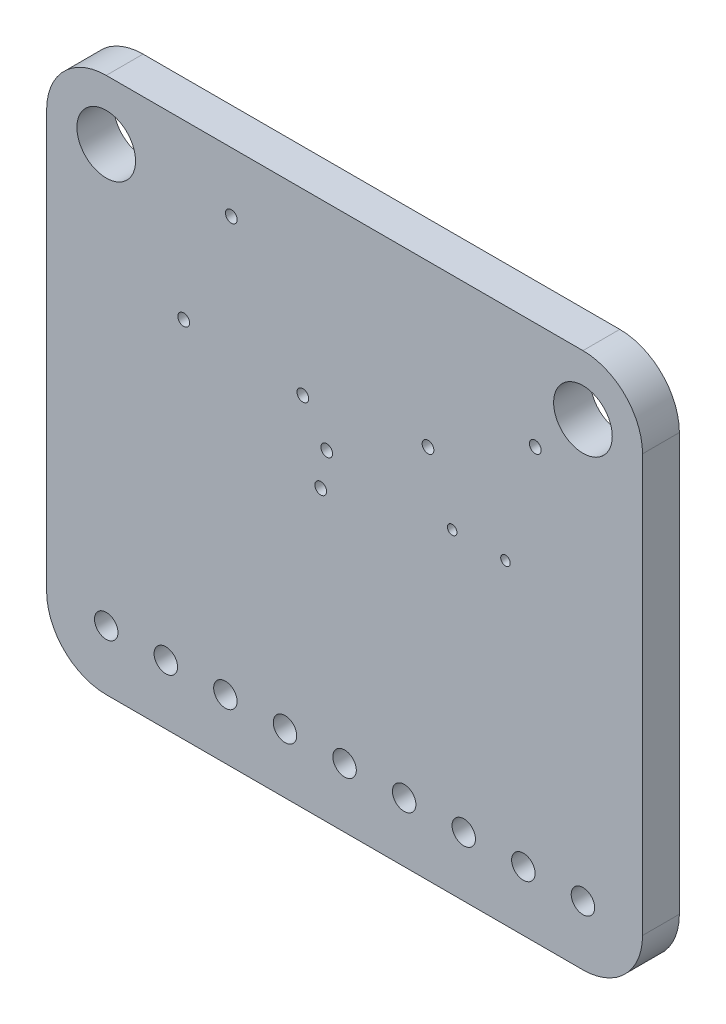
ISO-10303-21;
HEADER;
FILE_DESCRIPTION(('STEP AP214'),'2;1');
FILE_NAME('part.step','',(''),(''),'','','');
FILE_SCHEMA(('AUTOMOTIVE_DESIGN { 1 0 10303 214 1 1 1 1 }'));
ENDSEC;
DATA;
#1=APPLICATION_CONTEXT('core data for automotive mechanical design processes');
#2=APPLICATION_PROTOCOL_DEFINITION('international standard','automotive_design',2000,#1);
#3=PRODUCT_CONTEXT('',#1,'mechanical');
#4=PRODUCT('Part','Part','',(#3));
#5=PRODUCT_RELATED_PRODUCT_CATEGORY('part','',(#4));
#6=PRODUCT_DEFINITION_FORMATION('','',#4);
#7=PRODUCT_DEFINITION_CONTEXT('part definition',#1,'design');
#8=PRODUCT_DEFINITION('design','',#6,#7);
#9=PRODUCT_DEFINITION_SHAPE('','',#8);
#10=(LENGTH_UNIT() NAMED_UNIT(*) SI_UNIT(.MILLI.,.METRE.));
#11=(NAMED_UNIT(*) PLANE_ANGLE_UNIT() SI_UNIT($,.RADIAN.));
#12=(NAMED_UNIT(*) SI_UNIT($,.STERADIAN.) SOLID_ANGLE_UNIT());
#13=UNCERTAINTY_MEASURE_WITH_UNIT(LENGTH_MEASURE(1.E-05),#10,'distance_accuracy_value','');
#14=(GEOMETRIC_REPRESENTATION_CONTEXT(3) GLOBAL_UNCERTAINTY_ASSIGNED_CONTEXT((#13)) GLOBAL_UNIT_ASSIGNED_CONTEXT((#10,
#11,#12)) REPRESENTATION_CONTEXT('',''));
#15=CARTESIAN_POINT('',(0.,0.,0.));
#16=DIRECTION('',(0.,0.,1.));
#17=DIRECTION('',(1.,0.,0.));
#18=AXIS2_PLACEMENT_3D('',#15,#16,#17);
#19=CARTESIAN_POINT('',(12.7,11.43,1.57));
#20=DIRECTION('',(0.,0.,1.));
#21=DIRECTION('',(1.,0.,0.));
#22=AXIS2_PLACEMENT_3D('',#19,#20,#21);
#23=PLANE('',#22);
#24=CARTESIAN_POINT('',(22.86,2.54,1.57));
#25=DIRECTION('',(0.,0.,1.));
#26=DIRECTION('',(1.,0.,0.));
#27=AXIS2_PLACEMENT_3D('',#24,#25,#26);
#28=CIRCLE('',#27,0.5);
#29=CARTESIAN_POINT('',(23.36,2.54,1.57));
#30=VERTEX_POINT('',#29);
#31=EDGE_CURVE('E186',#30,#30,#28,.F.);
#32=ORIENTED_EDGE('',*,*,#31,.T.);
#33=EDGE_LOOP('',(#32));
#34=FACE_BOUND('',#33,.T.);
#35=CARTESIAN_POINT('',(17.78,2.54,1.57));
#36=DIRECTION('',(0.,0.,1.));
#37=DIRECTION('',(1.,0.,0.));
#38=AXIS2_PLACEMENT_3D('',#35,#36,#37);
#39=CIRCLE('',#38,0.5);
#40=CARTESIAN_POINT('',(18.28,2.54,1.57));
#41=VERTEX_POINT('',#40);
#42=EDGE_CURVE('E189',#41,#41,#39,.F.);
#43=ORIENTED_EDGE('',*,*,#42,.T.);
#44=EDGE_LOOP('',(#43));
#45=FACE_BOUND('',#44,.T.);
#46=CARTESIAN_POINT('',(12.7,2.54,1.57));
#47=DIRECTION('',(0.,0.,1.));
#48=DIRECTION('',(1.,0.,0.));
#49=AXIS2_PLACEMENT_3D('',#46,#47,#48);
#50=CIRCLE('',#49,0.5);
#51=CARTESIAN_POINT('',(13.2,2.54,1.57));
#52=VERTEX_POINT('',#51);
#53=EDGE_CURVE('E192',#52,#52,#50,.F.);
#54=ORIENTED_EDGE('',*,*,#53,.T.);
#55=EDGE_LOOP('',(#54));
#56=FACE_BOUND('',#55,.T.);
#57=CARTESIAN_POINT('',(7.62,2.54,1.57));
#58=DIRECTION('',(0.,0.,1.));
#59=DIRECTION('',(1.,0.,0.));
#60=AXIS2_PLACEMENT_3D('',#57,#58,#59);
#61=CIRCLE('',#60,0.5);
#62=CARTESIAN_POINT('',(8.12,2.54,1.57));
#63=VERTEX_POINT('',#62);
#64=EDGE_CURVE('E195',#63,#63,#61,.F.);
#65=ORIENTED_EDGE('',*,*,#64,.T.);
#66=EDGE_LOOP('',(#65));
#67=FACE_BOUND('',#66,.T.);
#68=CARTESIAN_POINT('',(2.54,2.54,1.57));
#69=DIRECTION('',(0.,0.,1.));
#70=DIRECTION('',(1.,0.,0.));
#71=AXIS2_PLACEMENT_3D('',#68,#69,#70);
#72=CIRCLE('',#71,0.5);
#73=CARTESIAN_POINT('',(3.04,2.54,1.57));
#74=VERTEX_POINT('',#73);
#75=EDGE_CURVE('E198',#74,#74,#72,.F.);
#76=ORIENTED_EDGE('',*,*,#75,.T.);
#77=EDGE_LOOP('',(#76));
#78=FACE_BOUND('',#77,.T.);
#79=CARTESIAN_POINT('',(7.874,20.32,1.57));
#80=DIRECTION('',(0.,0.,1.));
#81=DIRECTION('',(1.,0.,0.));
#82=AXIS2_PLACEMENT_3D('',#79,#80,#81);
#83=CIRCLE('',#82,0.25);
#84=CARTESIAN_POINT('',(8.124,20.32,1.57));
#85=VERTEX_POINT('',#84);
#86=EDGE_CURVE('E201',#85,#85,#83,.F.);
#87=ORIENTED_EDGE('',*,*,#86,.T.);
#88=EDGE_LOOP('',(#87));
#89=FACE_BOUND('',#88,.T.);
#90=CARTESIAN_POINT('',(10.922,15.24,1.57));
#91=DIRECTION('',(0.,0.,1.));
#92=DIRECTION('',(1.,0.,0.));
#93=AXIS2_PLACEMENT_3D('',#90,#91,#92);
#94=CIRCLE('',#93,0.25);
#95=CARTESIAN_POINT('',(11.172,15.24,1.57));
#96=VERTEX_POINT('',#95);
#97=EDGE_CURVE('E204',#96,#96,#94,.F.);
#98=ORIENTED_EDGE('',*,*,#97,.T.);
#99=EDGE_LOOP('',(#98));
#100=FACE_BOUND('',#99,.T.);
#101=CARTESIAN_POINT('',(11.684,12.192,1.57));
#102=DIRECTION('',(0.,0.,1.));
#103=DIRECTION('',(1.,0.,0.));
#104=AXIS2_PLACEMENT_3D('',#101,#102,#103);
#105=CIRCLE('',#104,0.25);
#106=CARTESIAN_POINT('',(11.934,12.192,1.57));
#107=VERTEX_POINT('',#106);
#108=EDGE_CURVE('E207',#107,#107,#105,.F.);
#109=ORIENTED_EDGE('',*,*,#108,.T.);
#110=EDGE_LOOP('',(#109));
#111=FACE_BOUND('',#110,.T.);
#112=CARTESIAN_POINT('',(17.285,13.462,1.57));
#113=DIRECTION('',(0.,0.,1.));
#114=DIRECTION('',(1.,0.,0.));
#115=AXIS2_PLACEMENT_3D('',#112,#113,#114);
#116=CIRCLE('',#115,0.203);
#117=CARTESIAN_POINT('',(17.488,13.462,1.57));
#118=VERTEX_POINT('',#117);
#119=EDGE_CURVE('E210',#118,#118,#116,.F.);
#120=ORIENTED_EDGE('',*,*,#119,.T.);
#121=EDGE_LOOP('',(#120));
#122=FACE_BOUND('',#121,.T.);
#123=CARTESIAN_POINT('',(20.828,18.288,1.57));
#124=DIRECTION('',(0.,0.,1.));
#125=DIRECTION('',(1.,0.,0.));
#126=AXIS2_PLACEMENT_3D('',#123,#124,#125);
#127=CIRCLE('',#126,0.25);
#128=CARTESIAN_POINT('',(21.078,18.288,1.57));
#129=VERTEX_POINT('',#128);
#130=EDGE_CURVE('E213',#129,#129,#127,.F.);
#131=ORIENTED_EDGE('',*,*,#130,.T.);
#132=EDGE_LOOP('',(#131));
#133=FACE_BOUND('',#132,.T.);
#134=CARTESIAN_POINT('',(5.842,15.494,1.57));
#135=DIRECTION('',(0.,0.,1.));
#136=DIRECTION('',(1.,0.,0.));
#137=AXIS2_PLACEMENT_3D('',#134,#135,#136);
#138=CIRCLE('',#137,0.25);
#139=CARTESIAN_POINT('',(6.092,15.494,1.57));
#140=VERTEX_POINT('',#139);
#141=EDGE_CURVE('E216',#140,#140,#138,.F.);
#142=ORIENTED_EDGE('',*,*,#141,.T.);
#143=EDGE_LOOP('',(#142));
#144=FACE_BOUND('',#143,.T.);
#145=CARTESIAN_POINT('',(16.256,16.002,1.57));
#146=DIRECTION('',(0.,0.,1.));
#147=DIRECTION('',(1.,0.,0.));
#148=AXIS2_PLACEMENT_3D('',#145,#146,#147);
#149=CIRCLE('',#148,0.25);
#150=CARTESIAN_POINT('',(16.506,16.002,1.57));
#151=VERTEX_POINT('',#150);
#152=EDGE_CURVE('E219',#151,#151,#149,.F.);
#153=ORIENTED_EDGE('',*,*,#152,.T.);
#154=EDGE_LOOP('',(#153));
#155=FACE_BOUND('',#154,.T.);
#156=CARTESIAN_POINT('',(19.558,13.462,1.57));
#157=DIRECTION('',(0.,0.,1.));
#158=DIRECTION('',(1.,0.,0.));
#159=AXIS2_PLACEMENT_3D('',#156,#157,#158);
#160=CIRCLE('',#159,0.203);
#161=CARTESIAN_POINT('',(19.761,13.462,1.57));
#162=VERTEX_POINT('',#161);
#163=EDGE_CURVE('E222',#162,#162,#160,.F.);
#164=ORIENTED_EDGE('',*,*,#163,.T.);
#165=EDGE_LOOP('',(#164));
#166=FACE_BOUND('',#165,.T.);
#167=CARTESIAN_POINT('',(11.938,13.716,1.57));
#168=DIRECTION('',(0.,0.,1.));
#169=DIRECTION('',(1.,0.,0.));
#170=AXIS2_PLACEMENT_3D('',#167,#168,#169);
#171=CIRCLE('',#170,0.25);
#172=CARTESIAN_POINT('',(12.188,13.716,1.57));
#173=VERTEX_POINT('',#172);
#174=EDGE_CURVE('E225',#173,#173,#171,.F.);
#175=ORIENTED_EDGE('',*,*,#174,.T.);
#176=EDGE_LOOP('',(#175));
#177=FACE_BOUND('',#176,.T.);
#178=CARTESIAN_POINT('',(2.54,20.32,1.57));
#179=DIRECTION('',(0.,0.,1.));
#180=DIRECTION('',(1.,0.,0.));
#181=AXIS2_PLACEMENT_3D('',#178,#179,#180);
#182=CIRCLE('',#181,1.25);
#183=CARTESIAN_POINT('',(3.79,20.32,1.57));
#184=VERTEX_POINT('',#183);
#185=EDGE_CURVE('E228',#184,#184,#182,.F.);
#186=ORIENTED_EDGE('',*,*,#185,.T.);
#187=EDGE_LOOP('',(#186));
#188=FACE_BOUND('',#187,.T.);
#189=CARTESIAN_POINT('',(22.86,20.32,1.57));
#190=DIRECTION('',(0.,0.,1.));
#191=DIRECTION('',(1.,0.,0.));
#192=AXIS2_PLACEMENT_3D('',#189,#190,#191);
#193=CIRCLE('',#192,1.25);
#194=CARTESIAN_POINT('',(24.11,20.32,1.57));
#195=VERTEX_POINT('',#194);
#196=EDGE_CURVE('E231',#195,#195,#193,.F.);
#197=ORIENTED_EDGE('',*,*,#196,.T.);
#198=EDGE_LOOP('',(#197));
#199=FACE_BOUND('',#198,.T.);
#200=CARTESIAN_POINT('',(5.08,2.54,1.57));
#201=DIRECTION('',(0.,0.,1.));
#202=DIRECTION('',(1.,0.,0.));
#203=AXIS2_PLACEMENT_3D('',#200,#201,#202);
#204=CIRCLE('',#203,0.5);
#205=CARTESIAN_POINT('',(5.58,2.54,1.57));
#206=VERTEX_POINT('',#205);
#207=EDGE_CURVE('E234',#206,#206,#204,.F.);
#208=ORIENTED_EDGE('',*,*,#207,.T.);
#209=EDGE_LOOP('',(#208));
#210=FACE_BOUND('',#209,.T.);
#211=CARTESIAN_POINT('',(10.16,2.54,1.57));
#212=DIRECTION('',(0.,0.,1.));
#213=DIRECTION('',(1.,0.,0.));
#214=AXIS2_PLACEMENT_3D('',#211,#212,#213);
#215=CIRCLE('',#214,0.5);
#216=CARTESIAN_POINT('',(10.66,2.54,1.57));
#217=VERTEX_POINT('',#216);
#218=EDGE_CURVE('E237',#217,#217,#215,.F.);
#219=ORIENTED_EDGE('',*,*,#218,.T.);
#220=EDGE_LOOP('',(#219));
#221=FACE_BOUND('',#220,.T.);
#222=CARTESIAN_POINT('',(15.24,2.54,1.57));
#223=DIRECTION('',(0.,0.,1.));
#224=DIRECTION('',(1.,0.,0.));
#225=AXIS2_PLACEMENT_3D('',#222,#223,#224);
#226=CIRCLE('',#225,0.5);
#227=CARTESIAN_POINT('',(15.74,2.54,1.57));
#228=VERTEX_POINT('',#227);
#229=EDGE_CURVE('E240',#228,#228,#226,.F.);
#230=ORIENTED_EDGE('',*,*,#229,.T.);
#231=EDGE_LOOP('',(#230));
#232=FACE_BOUND('',#231,.T.);
#233=CARTESIAN_POINT('',(20.32,2.54,1.57));
#234=DIRECTION('',(0.,0.,1.));
#235=DIRECTION('',(1.,0.,0.));
#236=AXIS2_PLACEMENT_3D('',#233,#234,#235);
#237=CIRCLE('',#236,0.5);
#238=CARTESIAN_POINT('',(20.82,2.54,1.57));
#239=VERTEX_POINT('',#238);
#240=EDGE_CURVE('E243',#239,#239,#237,.F.);
#241=ORIENTED_EDGE('',*,*,#240,.T.);
#242=EDGE_LOOP('',(#241));
#243=FACE_BOUND('',#242,.T.);
#244=CARTESIAN_POINT('',(2.54,2.54,1.57));
#245=DIRECTION('',(0.,0.,1.));
#246=DIRECTION('',(1.,0.,0.));
#247=AXIS2_PLACEMENT_3D('',#244,#245,#246);
#248=CIRCLE('',#247,2.54);
#249=CARTESIAN_POINT('',(2.54,0.,1.57));
#250=VERTEX_POINT('',#249);
#251=CARTESIAN_POINT('',(0.,2.54,1.57));
#252=VERTEX_POINT('',#251);
#253=EDGE_CURVE('E248',#250,#252,#248,.F.);
#254=ORIENTED_EDGE('',*,*,#253,.F.);
#255=DIRECTION('',(1.,0.,0.));
#256=VECTOR('',#255,1.);
#257=CARTESIAN_POINT('',(2.54,0.,1.57));
#258=LINE('',#257,#256);
#259=CARTESIAN_POINT('',(22.86,0.,1.57));
#260=VERTEX_POINT('',#259);
#261=EDGE_CURVE('E109',#260,#250,#258,.F.);
#262=ORIENTED_EDGE('',*,*,#261,.F.);
#263=CARTESIAN_POINT('',(22.86,2.54,1.57));
#264=DIRECTION('',(0.,0.,1.));
#265=DIRECTION('',(1.,0.,0.));
#266=AXIS2_PLACEMENT_3D('',#263,#264,#265);
#267=CIRCLE('',#266,2.54);
#268=CARTESIAN_POINT('',(25.4,2.54,1.57));
#269=VERTEX_POINT('',#268);
#270=EDGE_CURVE('E96',#269,#260,#267,.F.);
#271=ORIENTED_EDGE('',*,*,#270,.F.);
#272=DIRECTION('',(0.,1.,0.));
#273=VECTOR('',#272,1.);
#274=CARTESIAN_POINT('',(25.4,2.54,1.57));
#275=LINE('',#274,#273);
#276=CARTESIAN_POINT('',(25.4,20.32,1.57));
#277=VERTEX_POINT('',#276);
#278=EDGE_CURVE('E92',#277,#269,#275,.F.);
#279=ORIENTED_EDGE('',*,*,#278,.F.);
#280=CARTESIAN_POINT('',(22.86,20.32,1.57));
#281=DIRECTION('',(0.,0.,1.));
#282=DIRECTION('',(1.,0.,0.));
#283=AXIS2_PLACEMENT_3D('',#280,#281,#282);
#284=CIRCLE('',#283,2.54);
#285=CARTESIAN_POINT('',(22.86,22.86,1.57));
#286=VERTEX_POINT('',#285);
#287=EDGE_CURVE('E20',#286,#277,#284,.F.);
#288=ORIENTED_EDGE('',*,*,#287,.F.);
#289=DIRECTION('',(1.,0.,0.));
#290=VECTOR('',#289,1.);
#291=CARTESIAN_POINT('',(22.86,22.86,1.57));
#292=LINE('',#291,#290);
#293=CARTESIAN_POINT('',(2.54,22.86,1.57));
#294=VERTEX_POINT('',#293);
#295=EDGE_CURVE('E79',#294,#286,#292,.T.);
#296=ORIENTED_EDGE('',*,*,#295,.F.);
#297=CARTESIAN_POINT('',(2.54,20.32,1.57));
#298=DIRECTION('',(0.,0.,1.));
#299=DIRECTION('',(1.,0.,0.));
#300=AXIS2_PLACEMENT_3D('',#297,#298,#299);
#301=CIRCLE('',#300,2.54);
#302=CARTESIAN_POINT('',(0.,20.32,1.57));
#303=VERTEX_POINT('',#302);
#304=EDGE_CURVE('E249',#303,#294,#301,.F.);
#305=ORIENTED_EDGE('',*,*,#304,.F.);
#306=DIRECTION('',(0.,-1.,0.));
#307=VECTOR('',#306,1.);
#308=CARTESIAN_POINT('',(0.,20.32,1.57));
#309=LINE('',#308,#307);
#310=EDGE_CURVE('E113',#252,#303,#309,.F.);
#311=ORIENTED_EDGE('',*,*,#310,.F.);
#312=EDGE_LOOP('',(#254,#262,#271,#279,#288,#296,#305,#311));
#313=FACE_BOUND('',#312,.T.);
#314=ADVANCED_FACE('F17',(#34,#45,#56,#67,#78,#89,#100,#111,#122,#133,#144,#155,#166,#177,#188,
#199,#210,#221,#232,#243,#313),#23,.T.);
#315=CARTESIAN_POINT('',(25.4,2.54,0.));
#316=DIRECTION('',(1.,0.,0.));
#317=DIRECTION('',(0.,0.,-1.));
#318=AXIS2_PLACEMENT_3D('',#315,#316,#317);
#319=PLANE('',#318);
#320=ORIENTED_EDGE('',*,*,#278,.T.);
#321=DIRECTION('',(0.,0.,1.));
#322=VECTOR('',#321,1.);
#323=CARTESIAN_POINT('',(25.4,2.54,0.));
#324=LINE('',#323,#322);
#325=CARTESIAN_POINT('',(25.4,2.54,0.));
#326=VERTEX_POINT('',#325);
#327=EDGE_CURVE('E247',#326,#269,#324,.T.);
#328=ORIENTED_EDGE('',*,*,#327,.F.);
#329=DIRECTION('',(0.,1.,0.));
#330=VECTOR('',#329,1.);
#331=CARTESIAN_POINT('',(25.4,11.43,0.));
#332=LINE('',#331,#330);
#333=CARTESIAN_POINT('',(25.4,20.32,0.));
#334=VERTEX_POINT('',#333);
#335=EDGE_CURVE('E103',#326,#334,#332,.T.);
#336=ORIENTED_EDGE('',*,*,#335,.T.);
#337=DIRECTION('',(0.,0.,1.));
#338=VECTOR('',#337,1.);
#339=CARTESIAN_POINT('',(25.4,20.32,0.));
#340=LINE('',#339,#338);
#341=EDGE_CURVE('E88',#277,#334,#340,.F.);
#342=ORIENTED_EDGE('',*,*,#341,.F.);
#343=EDGE_LOOP('',(#320,#328,#336,#342));
#344=FACE_BOUND('',#343,.T.);
#345=ADVANCED_FACE('F102',(#344),#319,.T.);
#346=CARTESIAN_POINT('',(22.86,20.32,0.));
#347=DIRECTION('',(0.,0.,1.));
#348=DIRECTION('',(1.,0.,0.));
#349=AXIS2_PLACEMENT_3D('',#346,#347,#348);
#350=CYLINDRICAL_SURFACE('',#349,2.54);
#351=ORIENTED_EDGE('',*,*,#287,.T.);
#352=ORIENTED_EDGE('',*,*,#341,.T.);
#353=CARTESIAN_POINT('',(22.86,20.32,0.));
#354=DIRECTION('',(0.,0.,1.));
#355=DIRECTION('',(1.,0.,0.));
#356=AXIS2_PLACEMENT_3D('',#353,#354,#355);
#357=CIRCLE('',#356,2.54);
#358=CARTESIAN_POINT('',(22.86,22.86,0.));
#359=VERTEX_POINT('',#358);
#360=EDGE_CURVE('E184',#334,#359,#357,.T.);
#361=ORIENTED_EDGE('',*,*,#360,.T.);
#362=DIRECTION('',(0.,0.,1.));
#363=VECTOR('',#362,1.);
#364=CARTESIAN_POINT('',(22.86,22.86,0.));
#365=LINE('',#364,#363);
#366=EDGE_CURVE('E90',#286,#359,#365,.F.);
#367=ORIENTED_EDGE('',*,*,#366,.F.);
#368=EDGE_LOOP('',(#351,#352,#361,#367));
#369=FACE_BOUND('',#368,.T.);
#370=ADVANCED_FACE('F85',(#369),#350,.T.);
#371=CARTESIAN_POINT('',(22.86,22.86,0.));
#372=DIRECTION('',(0.,1.,0.));
#373=DIRECTION('',(0.,0.,1.));
#374=AXIS2_PLACEMENT_3D('',#371,#372,#373);
#375=PLANE('',#374);
#376=ORIENTED_EDGE('',*,*,#295,.T.);
#377=ORIENTED_EDGE('',*,*,#366,.T.);
#378=DIRECTION('',(1.,0.,0.));
#379=VECTOR('',#378,1.);
#380=CARTESIAN_POINT('',(12.7,22.86,0.));
#381=LINE('',#380,#379);
#382=CARTESIAN_POINT('',(2.54,22.86,0.));
#383=VERTEX_POINT('',#382);
#384=EDGE_CURVE('E183',#359,#383,#381,.F.);
#385=ORIENTED_EDGE('',*,*,#384,.T.);
#386=DIRECTION('',(0.,0.,1.));
#387=VECTOR('',#386,1.);
#388=CARTESIAN_POINT('',(2.54,22.86,0.));
#389=LINE('',#388,#387);
#390=EDGE_CURVE('E115',#294,#383,#389,.F.);
#391=ORIENTED_EDGE('',*,*,#390,.F.);
#392=EDGE_LOOP('',(#376,#377,#385,#391));
#393=FACE_BOUND('',#392,.T.);
#394=ADVANCED_FACE('F255',(#393),#375,.T.);
#395=CARTESIAN_POINT('',(2.54,20.32,0.));
#396=DIRECTION('',(0.,0.,1.));
#397=DIRECTION('',(1.,0.,0.));
#398=AXIS2_PLACEMENT_3D('',#395,#396,#397);
#399=CYLINDRICAL_SURFACE('',#398,2.54);
#400=ORIENTED_EDGE('',*,*,#304,.T.);
#401=ORIENTED_EDGE('',*,*,#390,.T.);
#402=CARTESIAN_POINT('',(2.54,20.32,0.));
#403=DIRECTION('',(0.,0.,1.));
#404=DIRECTION('',(1.,0.,0.));
#405=AXIS2_PLACEMENT_3D('',#402,#403,#404);
#406=CIRCLE('',#405,2.54);
#407=CARTESIAN_POINT('',(0.,20.32,0.));
#408=VERTEX_POINT('',#407);
#409=EDGE_CURVE('E180',#383,#408,#406,.T.);
#410=ORIENTED_EDGE('',*,*,#409,.T.);
#411=DIRECTION('',(0.,0.,1.));
#412=VECTOR('',#411,1.);
#413=CARTESIAN_POINT('',(0.,20.32,0.));
#414=LINE('',#413,#412);
#415=EDGE_CURVE('E114',#303,#408,#414,.F.);
#416=ORIENTED_EDGE('',*,*,#415,.F.);
#417=EDGE_LOOP('',(#400,#401,#410,#416));
#418=FACE_BOUND('',#417,.T.);
#419=ADVANCED_FACE('F276',(#418),#399,.T.);
#420=CARTESIAN_POINT('',(0.,20.32,0.));
#421=DIRECTION('',(-1.,0.,0.));
#422=DIRECTION('',(0.,-1.,0.));
#423=AXIS2_PLACEMENT_3D('',#420,#421,#422);
#424=PLANE('',#423);
#425=ORIENTED_EDGE('',*,*,#310,.T.);
#426=ORIENTED_EDGE('',*,*,#415,.T.);
#427=DIRECTION('',(0.,1.,0.));
#428=VECTOR('',#427,1.);
#429=CARTESIAN_POINT('',(0.,11.43,0.));
#430=LINE('',#429,#428);
#431=CARTESIAN_POINT('',(0.,2.54,0.));
#432=VERTEX_POINT('',#431);
#433=EDGE_CURVE('E179',#408,#432,#430,.F.);
#434=ORIENTED_EDGE('',*,*,#433,.T.);
#435=DIRECTION('',(0.,0.,1.));
#436=VECTOR('',#435,1.);
#437=CARTESIAN_POINT('',(0.,2.54,0.));
#438=LINE('',#437,#436);
#439=EDGE_CURVE('E111',#252,#432,#438,.F.);
#440=ORIENTED_EDGE('',*,*,#439,.F.);
#441=EDGE_LOOP('',(#425,#426,#434,#440));
#442=FACE_BOUND('',#441,.T.);
#443=ADVANCED_FACE('F272',(#442),#424,.T.);
#444=CARTESIAN_POINT('',(2.54,2.54,0.));
#445=DIRECTION('',(0.,0.,1.));
#446=DIRECTION('',(1.,0.,0.));
#447=AXIS2_PLACEMENT_3D('',#444,#445,#446);
#448=CYLINDRICAL_SURFACE('',#447,2.54);
#449=ORIENTED_EDGE('',*,*,#253,.T.);
#450=ORIENTED_EDGE('',*,*,#439,.T.);
#451=CARTESIAN_POINT('',(2.54,2.54,0.));
#452=DIRECTION('',(0.,0.,1.));
#453=DIRECTION('',(1.,0.,0.));
#454=AXIS2_PLACEMENT_3D('',#451,#452,#453);
#455=CIRCLE('',#454,2.54);
#456=CARTESIAN_POINT('',(2.54,0.,0.));
#457=VERTEX_POINT('',#456);
#458=EDGE_CURVE('E176',#432,#457,#455,.T.);
#459=ORIENTED_EDGE('',*,*,#458,.T.);
#460=DIRECTION('',(0.,0.,-1.));
#461=VECTOR('',#460,1.);
#462=CARTESIAN_POINT('',(2.54,0.,0.));
#463=LINE('',#462,#461);
#464=EDGE_CURVE('E110',#250,#457,#463,.T.);
#465=ORIENTED_EDGE('',*,*,#464,.F.);
#466=EDGE_LOOP('',(#449,#450,#459,#465));
#467=FACE_BOUND('',#466,.T.);
#468=ADVANCED_FACE('F284',(#467),#448,.T.);
#469=CARTESIAN_POINT('',(2.54,0.,0.));
#470=DIRECTION('',(0.,-1.,0.));
#471=DIRECTION('',(0.,0.,-1.));
#472=AXIS2_PLACEMENT_3D('',#469,#470,#471);
#473=PLANE('',#472);
#474=ORIENTED_EDGE('',*,*,#261,.T.);
#475=ORIENTED_EDGE('',*,*,#464,.T.);
#476=DIRECTION('',(1.,0.,0.));
#477=VECTOR('',#476,1.);
#478=CARTESIAN_POINT('',(12.7,0.,0.));
#479=LINE('',#478,#477);
#480=CARTESIAN_POINT('',(22.86,0.,0.));
#481=VERTEX_POINT('',#480);
#482=EDGE_CURVE('E175',#457,#481,#479,.T.);
#483=ORIENTED_EDGE('',*,*,#482,.T.);
#484=DIRECTION('',(0.,0.,1.));
#485=VECTOR('',#484,1.);
#486=CARTESIAN_POINT('',(22.86,0.,0.));
#487=LINE('',#486,#485);
#488=EDGE_CURVE('E35',#260,#481,#487,.F.);
#489=ORIENTED_EDGE('',*,*,#488,.F.);
#490=EDGE_LOOP('',(#474,#475,#483,#489));
#491=FACE_BOUND('',#490,.T.);
#492=ADVANCED_FACE('F378',(#491),#473,.T.);
#493=CARTESIAN_POINT('',(22.86,2.54,0.));
#494=DIRECTION('',(0.,0.,1.));
#495=DIRECTION('',(1.,0.,0.));
#496=AXIS2_PLACEMENT_3D('',#493,#494,#495);
#497=CYLINDRICAL_SURFACE('',#496,2.54);
#498=ORIENTED_EDGE('',*,*,#270,.T.);
#499=ORIENTED_EDGE('',*,*,#488,.T.);
#500=CARTESIAN_POINT('',(22.86,2.54,0.));
#501=DIRECTION('',(0.,0.,1.));
#502=DIRECTION('',(1.,0.,0.));
#503=AXIS2_PLACEMENT_3D('',#500,#501,#502);
#504=CIRCLE('',#503,2.54);
#505=EDGE_CURVE('E173',#481,#326,#504,.T.);
#506=ORIENTED_EDGE('',*,*,#505,.T.);
#507=ORIENTED_EDGE('',*,*,#327,.T.);
#508=EDGE_LOOP('',(#498,#499,#506,#507));
#509=FACE_BOUND('',#508,.T.);
#510=ADVANCED_FACE('F374',(#509),#497,.T.);
#511=CARTESIAN_POINT('',(20.32,2.54,0.));
#512=DIRECTION('',(0.,0.,1.));
#513=DIRECTION('',(1.,0.,0.));
#514=AXIS2_PLACEMENT_3D('',#511,#512,#513);
#515=CYLINDRICAL_SURFACE('',#514,0.5);
#516=ORIENTED_EDGE('',*,*,#240,.F.);
#517=EDGE_LOOP('',(#516));
#518=FACE_BOUND('',#517,.T.);
#519=CARTESIAN_POINT('',(20.32,2.54,0.));
#520=DIRECTION('',(0.,0.,1.));
#521=DIRECTION('',(1.,0.,0.));
#522=AXIS2_PLACEMENT_3D('',#519,#520,#521);
#523=CIRCLE('',#522,0.5);
#524=CARTESIAN_POINT('',(20.82,2.54,0.));
#525=VERTEX_POINT('',#524);
#526=EDGE_CURVE('E170',#525,#525,#523,.F.);
#527=ORIENTED_EDGE('',*,*,#526,.T.);
#528=EDGE_LOOP('',(#527));
#529=FACE_BOUND('',#528,.T.);
#530=ADVANCED_FACE('F370',(#518,#529),#515,.F.);
#531=CARTESIAN_POINT('',(15.24,2.54,0.));
#532=DIRECTION('',(0.,0.,1.));
#533=DIRECTION('',(1.,0.,0.));
#534=AXIS2_PLACEMENT_3D('',#531,#532,#533);
#535=CYLINDRICAL_SURFACE('',#534,0.5);
#536=ORIENTED_EDGE('',*,*,#229,.F.);
#537=EDGE_LOOP('',(#536));
#538=FACE_BOUND('',#537,.T.);
#539=CARTESIAN_POINT('',(15.24,2.54,0.));
#540=DIRECTION('',(0.,0.,1.));
#541=DIRECTION('',(1.,0.,0.));
#542=AXIS2_PLACEMENT_3D('',#539,#540,#541);
#543=CIRCLE('',#542,0.5);
#544=CARTESIAN_POINT('',(15.74,2.54,0.));
#545=VERTEX_POINT('',#544);
#546=EDGE_CURVE('E167',#545,#545,#543,.F.);
#547=ORIENTED_EDGE('',*,*,#546,.T.);
#548=EDGE_LOOP('',(#547));
#549=FACE_BOUND('',#548,.T.);
#550=ADVANCED_FACE('F366',(#538,#549),#535,.F.);
#551=CARTESIAN_POINT('',(10.16,2.54,0.));
#552=DIRECTION('',(0.,0.,1.));
#553=DIRECTION('',(1.,0.,0.));
#554=AXIS2_PLACEMENT_3D('',#551,#552,#553);
#555=CYLINDRICAL_SURFACE('',#554,0.5);
#556=ORIENTED_EDGE('',*,*,#218,.F.);
#557=EDGE_LOOP('',(#556));
#558=FACE_BOUND('',#557,.T.);
#559=CARTESIAN_POINT('',(10.16,2.54,0.));
#560=DIRECTION('',(0.,0.,1.));
#561=DIRECTION('',(1.,0.,0.));
#562=AXIS2_PLACEMENT_3D('',#559,#560,#561);
#563=CIRCLE('',#562,0.5);
#564=CARTESIAN_POINT('',(10.66,2.54,0.));
#565=VERTEX_POINT('',#564);
#566=EDGE_CURVE('E164',#565,#565,#563,.F.);
#567=ORIENTED_EDGE('',*,*,#566,.T.);
#568=EDGE_LOOP('',(#567));
#569=FACE_BOUND('',#568,.T.);
#570=ADVANCED_FACE('F362',(#558,#569),#555,.F.);
#571=CARTESIAN_POINT('',(5.08,2.54,0.));
#572=DIRECTION('',(0.,0.,1.));
#573=DIRECTION('',(1.,0.,0.));
#574=AXIS2_PLACEMENT_3D('',#571,#572,#573);
#575=CYLINDRICAL_SURFACE('',#574,0.5);
#576=ORIENTED_EDGE('',*,*,#207,.F.);
#577=EDGE_LOOP('',(#576));
#578=FACE_BOUND('',#577,.T.);
#579=CARTESIAN_POINT('',(5.08,2.54,0.));
#580=DIRECTION('',(0.,0.,1.));
#581=DIRECTION('',(1.,0.,0.));
#582=AXIS2_PLACEMENT_3D('',#579,#580,#581);
#583=CIRCLE('',#582,0.5);
#584=CARTESIAN_POINT('',(5.58,2.54,0.));
#585=VERTEX_POINT('',#584);
#586=EDGE_CURVE('E161',#585,#585,#583,.F.);
#587=ORIENTED_EDGE('',*,*,#586,.T.);
#588=EDGE_LOOP('',(#587));
#589=FACE_BOUND('',#588,.T.);
#590=ADVANCED_FACE('F358',(#578,#589),#575,.F.);
#591=CARTESIAN_POINT('',(22.86,20.32,0.));
#592=DIRECTION('',(0.,0.,1.));
#593=DIRECTION('',(1.,0.,0.));
#594=AXIS2_PLACEMENT_3D('',#591,#592,#593);
#595=CYLINDRICAL_SURFACE('',#594,1.25);
#596=ORIENTED_EDGE('',*,*,#196,.F.);
#597=EDGE_LOOP('',(#596));
#598=FACE_BOUND('',#597,.T.);
#599=CARTESIAN_POINT('',(22.86,20.32,0.));
#600=DIRECTION('',(0.,0.,1.));
#601=DIRECTION('',(1.,0.,0.));
#602=AXIS2_PLACEMENT_3D('',#599,#600,#601);
#603=CIRCLE('',#602,1.25);
#604=CARTESIAN_POINT('',(24.11,20.32,0.));
#605=VERTEX_POINT('',#604);
#606=EDGE_CURVE('E158',#605,#605,#603,.F.);
#607=ORIENTED_EDGE('',*,*,#606,.T.);
#608=EDGE_LOOP('',(#607));
#609=FACE_BOUND('',#608,.T.);
#610=ADVANCED_FACE('F354',(#598,#609),#595,.F.);
#611=CARTESIAN_POINT('',(2.54,20.32,0.));
#612=DIRECTION('',(0.,0.,1.));
#613=DIRECTION('',(1.,0.,0.));
#614=AXIS2_PLACEMENT_3D('',#611,#612,#613);
#615=CYLINDRICAL_SURFACE('',#614,1.25);
#616=ORIENTED_EDGE('',*,*,#185,.F.);
#617=EDGE_LOOP('',(#616));
#618=FACE_BOUND('',#617,.T.);
#619=CARTESIAN_POINT('',(2.54,20.32,0.));
#620=DIRECTION('',(0.,0.,1.));
#621=DIRECTION('',(1.,0.,0.));
#622=AXIS2_PLACEMENT_3D('',#619,#620,#621);
#623=CIRCLE('',#622,1.25);
#624=CARTESIAN_POINT('',(3.79,20.32,0.));
#625=VERTEX_POINT('',#624);
#626=EDGE_CURVE('E155',#625,#625,#623,.F.);
#627=ORIENTED_EDGE('',*,*,#626,.T.);
#628=EDGE_LOOP('',(#627));
#629=FACE_BOUND('',#628,.T.);
#630=ADVANCED_FACE('F350',(#618,#629),#615,.F.);
#631=CARTESIAN_POINT('',(11.938,13.716,0.));
#632=DIRECTION('',(0.,0.,1.));
#633=DIRECTION('',(1.,0.,0.));
#634=AXIS2_PLACEMENT_3D('',#631,#632,#633);
#635=CYLINDRICAL_SURFACE('',#634,0.25);
#636=ORIENTED_EDGE('',*,*,#174,.F.);
#637=EDGE_LOOP('',(#636));
#638=FACE_BOUND('',#637,.T.);
#639=CARTESIAN_POINT('',(11.938,13.716,0.));
#640=DIRECTION('',(0.,0.,1.));
#641=DIRECTION('',(1.,0.,0.));
#642=AXIS2_PLACEMENT_3D('',#639,#640,#641);
#643=CIRCLE('',#642,0.25);
#644=CARTESIAN_POINT('',(12.188,13.716,0.));
#645=VERTEX_POINT('',#644);
#646=EDGE_CURVE('E152',#645,#645,#643,.F.);
#647=ORIENTED_EDGE('',*,*,#646,.T.);
#648=EDGE_LOOP('',(#647));
#649=FACE_BOUND('',#648,.T.);
#650=ADVANCED_FACE('F346',(#638,#649),#635,.F.);
#651=CARTESIAN_POINT('',(19.558,13.462,0.));
#652=DIRECTION('',(0.,0.,1.));
#653=DIRECTION('',(1.,0.,0.));
#654=AXIS2_PLACEMENT_3D('',#651,#652,#653);
#655=CYLINDRICAL_SURFACE('',#654,0.203);
#656=ORIENTED_EDGE('',*,*,#163,.F.);
#657=EDGE_LOOP('',(#656));
#658=FACE_BOUND('',#657,.T.);
#659=CARTESIAN_POINT('',(19.558,13.462,0.));
#660=DIRECTION('',(0.,0.,1.));
#661=DIRECTION('',(1.,0.,0.));
#662=AXIS2_PLACEMENT_3D('',#659,#660,#661);
#663=CIRCLE('',#662,0.203);
#664=CARTESIAN_POINT('',(19.761,13.462,0.));
#665=VERTEX_POINT('',#664);
#666=EDGE_CURVE('E149',#665,#665,#663,.F.);
#667=ORIENTED_EDGE('',*,*,#666,.T.);
#668=EDGE_LOOP('',(#667));
#669=FACE_BOUND('',#668,.T.);
#670=ADVANCED_FACE('F342',(#658,#669),#655,.F.);
#671=CARTESIAN_POINT('',(16.256,16.002,0.));
#672=DIRECTION('',(0.,0.,1.));
#673=DIRECTION('',(1.,0.,0.));
#674=AXIS2_PLACEMENT_3D('',#671,#672,#673);
#675=CYLINDRICAL_SURFACE('',#674,0.25);
#676=ORIENTED_EDGE('',*,*,#152,.F.);
#677=EDGE_LOOP('',(#676));
#678=FACE_BOUND('',#677,.T.);
#679=CARTESIAN_POINT('',(16.256,16.002,0.));
#680=DIRECTION('',(0.,0.,1.));
#681=DIRECTION('',(1.,0.,0.));
#682=AXIS2_PLACEMENT_3D('',#679,#680,#681);
#683=CIRCLE('',#682,0.25);
#684=CARTESIAN_POINT('',(16.506,16.002,0.));
#685=VERTEX_POINT('',#684);
#686=EDGE_CURVE('E146',#685,#685,#683,.F.);
#687=ORIENTED_EDGE('',*,*,#686,.T.);
#688=EDGE_LOOP('',(#687));
#689=FACE_BOUND('',#688,.T.);
#690=ADVANCED_FACE('F338',(#678,#689),#675,.F.);
#691=CARTESIAN_POINT('',(5.842,15.494,0.));
#692=DIRECTION('',(0.,0.,1.));
#693=DIRECTION('',(1.,0.,0.));
#694=AXIS2_PLACEMENT_3D('',#691,#692,#693);
#695=CYLINDRICAL_SURFACE('',#694,0.25);
#696=ORIENTED_EDGE('',*,*,#141,.F.);
#697=EDGE_LOOP('',(#696));
#698=FACE_BOUND('',#697,.T.);
#699=CARTESIAN_POINT('',(5.842,15.494,0.));
#700=DIRECTION('',(0.,0.,1.));
#701=DIRECTION('',(1.,0.,0.));
#702=AXIS2_PLACEMENT_3D('',#699,#700,#701);
#703=CIRCLE('',#702,0.25);
#704=CARTESIAN_POINT('',(6.092,15.494,0.));
#705=VERTEX_POINT('',#704);
#706=EDGE_CURVE('E143',#705,#705,#703,.F.);
#707=ORIENTED_EDGE('',*,*,#706,.T.);
#708=EDGE_LOOP('',(#707));
#709=FACE_BOUND('',#708,.T.);
#710=ADVANCED_FACE('F334',(#698,#709),#695,.F.);
#711=CARTESIAN_POINT('',(20.828,18.288,0.));
#712=DIRECTION('',(0.,0.,1.));
#713=DIRECTION('',(1.,0.,0.));
#714=AXIS2_PLACEMENT_3D('',#711,#712,#713);
#715=CYLINDRICAL_SURFACE('',#714,0.25);
#716=ORIENTED_EDGE('',*,*,#130,.F.);
#717=EDGE_LOOP('',(#716));
#718=FACE_BOUND('',#717,.T.);
#719=CARTESIAN_POINT('',(20.828,18.288,0.));
#720=DIRECTION('',(0.,0.,1.));
#721=DIRECTION('',(1.,0.,0.));
#722=AXIS2_PLACEMENT_3D('',#719,#720,#721);
#723=CIRCLE('',#722,0.25);
#724=CARTESIAN_POINT('',(21.078,18.288,0.));
#725=VERTEX_POINT('',#724);
#726=EDGE_CURVE('E140',#725,#725,#723,.F.);
#727=ORIENTED_EDGE('',*,*,#726,.T.);
#728=EDGE_LOOP('',(#727));
#729=FACE_BOUND('',#728,.T.);
#730=ADVANCED_FACE('F330',(#718,#729),#715,.F.);
#731=CARTESIAN_POINT('',(17.285,13.462,0.));
#732=DIRECTION('',(0.,0.,1.));
#733=DIRECTION('',(1.,0.,0.));
#734=AXIS2_PLACEMENT_3D('',#731,#732,#733);
#735=CYLINDRICAL_SURFACE('',#734,0.203);
#736=ORIENTED_EDGE('',*,*,#119,.F.);
#737=EDGE_LOOP('',(#736));
#738=FACE_BOUND('',#737,.T.);
#739=CARTESIAN_POINT('',(17.285,13.462,0.));
#740=DIRECTION('',(0.,0.,1.));
#741=DIRECTION('',(1.,0.,0.));
#742=AXIS2_PLACEMENT_3D('',#739,#740,#741);
#743=CIRCLE('',#742,0.203);
#744=CARTESIAN_POINT('',(17.488,13.462,0.));
#745=VERTEX_POINT('',#744);
#746=EDGE_CURVE('E137',#745,#745,#743,.F.);
#747=ORIENTED_EDGE('',*,*,#746,.T.);
#748=EDGE_LOOP('',(#747));
#749=FACE_BOUND('',#748,.T.);
#750=ADVANCED_FACE('F326',(#738,#749),#735,.F.);
#751=CARTESIAN_POINT('',(11.684,12.192,0.));
#752=DIRECTION('',(0.,0.,1.));
#753=DIRECTION('',(1.,0.,0.));
#754=AXIS2_PLACEMENT_3D('',#751,#752,#753);
#755=CYLINDRICAL_SURFACE('',#754,0.25);
#756=ORIENTED_EDGE('',*,*,#108,.F.);
#757=EDGE_LOOP('',(#756));
#758=FACE_BOUND('',#757,.T.);
#759=CARTESIAN_POINT('',(11.684,12.192,0.));
#760=DIRECTION('',(0.,0.,1.));
#761=DIRECTION('',(1.,0.,0.));
#762=AXIS2_PLACEMENT_3D('',#759,#760,#761);
#763=CIRCLE('',#762,0.25);
#764=CARTESIAN_POINT('',(11.934,12.192,0.));
#765=VERTEX_POINT('',#764);
#766=EDGE_CURVE('E134',#765,#765,#763,.F.);
#767=ORIENTED_EDGE('',*,*,#766,.T.);
#768=EDGE_LOOP('',(#767));
#769=FACE_BOUND('',#768,.T.);
#770=ADVANCED_FACE('F322',(#758,#769),#755,.F.);
#771=CARTESIAN_POINT('',(10.922,15.24,0.));
#772=DIRECTION('',(0.,0.,1.));
#773=DIRECTION('',(1.,0.,0.));
#774=AXIS2_PLACEMENT_3D('',#771,#772,#773);
#775=CYLINDRICAL_SURFACE('',#774,0.25);
#776=ORIENTED_EDGE('',*,*,#97,.F.);
#777=EDGE_LOOP('',(#776));
#778=FACE_BOUND('',#777,.T.);
#779=CARTESIAN_POINT('',(10.922,15.24,0.));
#780=DIRECTION('',(0.,0.,1.));
#781=DIRECTION('',(1.,0.,0.));
#782=AXIS2_PLACEMENT_3D('',#779,#780,#781);
#783=CIRCLE('',#782,0.25);
#784=CARTESIAN_POINT('',(11.172,15.24,0.));
#785=VERTEX_POINT('',#784);
#786=EDGE_CURVE('E131',#785,#785,#783,.F.);
#787=ORIENTED_EDGE('',*,*,#786,.T.);
#788=EDGE_LOOP('',(#787));
#789=FACE_BOUND('',#788,.T.);
#790=ADVANCED_FACE('F318',(#778,#789),#775,.F.);
#791=CARTESIAN_POINT('',(7.874,20.32,0.));
#792=DIRECTION('',(0.,0.,1.));
#793=DIRECTION('',(1.,0.,0.));
#794=AXIS2_PLACEMENT_3D('',#791,#792,#793);
#795=CYLINDRICAL_SURFACE('',#794,0.25);
#796=ORIENTED_EDGE('',*,*,#86,.F.);
#797=EDGE_LOOP('',(#796));
#798=FACE_BOUND('',#797,.T.);
#799=CARTESIAN_POINT('',(7.874,20.32,0.));
#800=DIRECTION('',(0.,0.,1.));
#801=DIRECTION('',(1.,0.,0.));
#802=AXIS2_PLACEMENT_3D('',#799,#800,#801);
#803=CIRCLE('',#802,0.25);
#804=CARTESIAN_POINT('',(8.124,20.32,0.));
#805=VERTEX_POINT('',#804);
#806=EDGE_CURVE('E128',#805,#805,#803,.F.);
#807=ORIENTED_EDGE('',*,*,#806,.T.);
#808=EDGE_LOOP('',(#807));
#809=FACE_BOUND('',#808,.T.);
#810=ADVANCED_FACE('F314',(#798,#809),#795,.F.);
#811=CARTESIAN_POINT('',(2.54,2.54,0.));
#812=DIRECTION('',(0.,0.,1.));
#813=DIRECTION('',(1.,0.,0.));
#814=AXIS2_PLACEMENT_3D('',#811,#812,#813);
#815=CYLINDRICAL_SURFACE('',#814,0.5);
#816=ORIENTED_EDGE('',*,*,#75,.F.);
#817=EDGE_LOOP('',(#816));
#818=FACE_BOUND('',#817,.T.);
#819=CARTESIAN_POINT('',(2.54,2.54,0.));
#820=DIRECTION('',(0.,0.,1.));
#821=DIRECTION('',(1.,0.,0.));
#822=AXIS2_PLACEMENT_3D('',#819,#820,#821);
#823=CIRCLE('',#822,0.5);
#824=CARTESIAN_POINT('',(3.04,2.54,0.));
#825=VERTEX_POINT('',#824);
#826=EDGE_CURVE('E125',#825,#825,#823,.F.);
#827=ORIENTED_EDGE('',*,*,#826,.T.);
#828=EDGE_LOOP('',(#827));
#829=FACE_BOUND('',#828,.T.);
#830=ADVANCED_FACE('F310',(#818,#829),#815,.F.);
#831=CARTESIAN_POINT('',(7.62,2.54,0.));
#832=DIRECTION('',(0.,0.,1.));
#833=DIRECTION('',(1.,0.,0.));
#834=AXIS2_PLACEMENT_3D('',#831,#832,#833);
#835=CYLINDRICAL_SURFACE('',#834,0.5);
#836=ORIENTED_EDGE('',*,*,#64,.F.);
#837=EDGE_LOOP('',(#836));
#838=FACE_BOUND('',#837,.T.);
#839=CARTESIAN_POINT('',(7.62,2.54,0.));
#840=DIRECTION('',(0.,0.,1.));
#841=DIRECTION('',(1.,0.,0.));
#842=AXIS2_PLACEMENT_3D('',#839,#840,#841);
#843=CIRCLE('',#842,0.5);
#844=CARTESIAN_POINT('',(8.12,2.54,0.));
#845=VERTEX_POINT('',#844);
#846=EDGE_CURVE('E122',#845,#845,#843,.F.);
#847=ORIENTED_EDGE('',*,*,#846,.T.);
#848=EDGE_LOOP('',(#847));
#849=FACE_BOUND('',#848,.T.);
#850=ADVANCED_FACE('F306',(#838,#849),#835,.F.);
#851=CARTESIAN_POINT('',(12.7,2.54,0.));
#852=DIRECTION('',(0.,0.,1.));
#853=DIRECTION('',(1.,0.,0.));
#854=AXIS2_PLACEMENT_3D('',#851,#852,#853);
#855=CYLINDRICAL_SURFACE('',#854,0.5);
#856=ORIENTED_EDGE('',*,*,#53,.F.);
#857=EDGE_LOOP('',(#856));
#858=FACE_BOUND('',#857,.T.);
#859=CARTESIAN_POINT('',(12.7,2.54,0.));
#860=DIRECTION('',(0.,0.,1.));
#861=DIRECTION('',(1.,0.,0.));
#862=AXIS2_PLACEMENT_3D('',#859,#860,#861);
#863=CIRCLE('',#862,0.5);
#864=CARTESIAN_POINT('',(13.2,2.54,0.));
#865=VERTEX_POINT('',#864);
#866=EDGE_CURVE('E119',#865,#865,#863,.F.);
#867=ORIENTED_EDGE('',*,*,#866,.T.);
#868=EDGE_LOOP('',(#867));
#869=FACE_BOUND('',#868,.T.);
#870=ADVANCED_FACE('F302',(#858,#869),#855,.F.);
#871=CARTESIAN_POINT('',(17.78,2.54,0.));
#872=DIRECTION('',(0.,0.,1.));
#873=DIRECTION('',(1.,0.,0.));
#874=AXIS2_PLACEMENT_3D('',#871,#872,#873);
#875=CYLINDRICAL_SURFACE('',#874,0.5);
#876=ORIENTED_EDGE('',*,*,#42,.F.);
#877=EDGE_LOOP('',(#876));
#878=FACE_BOUND('',#877,.T.);
#879=CARTESIAN_POINT('',(17.78,2.54,0.));
#880=DIRECTION('',(0.,0.,1.));
#881=DIRECTION('',(1.,0.,0.));
#882=AXIS2_PLACEMENT_3D('',#879,#880,#881);
#883=CIRCLE('',#882,0.5);
#884=CARTESIAN_POINT('',(18.28,2.54,0.));
#885=VERTEX_POINT('',#884);
#886=EDGE_CURVE('E26',#885,#885,#883,.F.);
#887=ORIENTED_EDGE('',*,*,#886,.T.);
#888=EDGE_LOOP('',(#887));
#889=FACE_BOUND('',#888,.T.);
#890=ADVANCED_FACE('F294',(#878,#889),#875,.F.);
#891=CARTESIAN_POINT('',(22.86,2.54,0.));
#892=DIRECTION('',(0.,0.,1.));
#893=DIRECTION('',(1.,0.,0.));
#894=AXIS2_PLACEMENT_3D('',#891,#892,#893);
#895=CYLINDRICAL_SURFACE('',#894,0.5);
#896=ORIENTED_EDGE('',*,*,#31,.F.);
#897=EDGE_LOOP('',(#896));
#898=FACE_BOUND('',#897,.T.);
#899=CARTESIAN_POINT('',(22.86,2.54,0.));
#900=DIRECTION('',(0.,0.,1.));
#901=DIRECTION('',(1.,0.,0.));
#902=AXIS2_PLACEMENT_3D('',#899,#900,#901);
#903=CIRCLE('',#902,0.5);
#904=CARTESIAN_POINT('',(23.36,2.54,0.));
#905=VERTEX_POINT('',#904);
#906=EDGE_CURVE('E11',#905,#905,#903,.F.);
#907=ORIENTED_EDGE('',*,*,#906,.T.);
#908=EDGE_LOOP('',(#907));
#909=FACE_BOUND('',#908,.T.);
#910=ADVANCED_FACE('F288',(#898,#909),#895,.F.);
#911=CARTESIAN_POINT('',(12.7,11.43,0.));
#912=DIRECTION('',(0.,0.,1.));
#913=DIRECTION('',(1.,0.,0.));
#914=AXIS2_PLACEMENT_3D('',#911,#912,#913);
#915=PLANE('',#914);
#916=ORIENTED_EDGE('',*,*,#906,.F.);
#917=EDGE_LOOP('',(#916));
#918=FACE_BOUND('',#917,.T.);
#919=ORIENTED_EDGE('',*,*,#886,.F.);
#920=EDGE_LOOP('',(#919));
#921=FACE_BOUND('',#920,.T.);
#922=ORIENTED_EDGE('',*,*,#866,.F.);
#923=EDGE_LOOP('',(#922));
#924=FACE_BOUND('',#923,.T.);
#925=ORIENTED_EDGE('',*,*,#846,.F.);
#926=EDGE_LOOP('',(#925));
#927=FACE_BOUND('',#926,.T.);
#928=ORIENTED_EDGE('',*,*,#826,.F.);
#929=EDGE_LOOP('',(#928));
#930=FACE_BOUND('',#929,.T.);
#931=ORIENTED_EDGE('',*,*,#806,.F.);
#932=EDGE_LOOP('',(#931));
#933=FACE_BOUND('',#932,.T.);
#934=ORIENTED_EDGE('',*,*,#786,.F.);
#935=EDGE_LOOP('',(#934));
#936=FACE_BOUND('',#935,.T.);
#937=ORIENTED_EDGE('',*,*,#766,.F.);
#938=EDGE_LOOP('',(#937));
#939=FACE_BOUND('',#938,.T.);
#940=ORIENTED_EDGE('',*,*,#746,.F.);
#941=EDGE_LOOP('',(#940));
#942=FACE_BOUND('',#941,.T.);
#943=ORIENTED_EDGE('',*,*,#726,.F.);
#944=EDGE_LOOP('',(#943));
#945=FACE_BOUND('',#944,.T.);
#946=ORIENTED_EDGE('',*,*,#706,.F.);
#947=EDGE_LOOP('',(#946));
#948=FACE_BOUND('',#947,.T.);
#949=ORIENTED_EDGE('',*,*,#686,.F.);
#950=EDGE_LOOP('',(#949));
#951=FACE_BOUND('',#950,.T.);
#952=ORIENTED_EDGE('',*,*,#666,.F.);
#953=EDGE_LOOP('',(#952));
#954=FACE_BOUND('',#953,.T.);
#955=ORIENTED_EDGE('',*,*,#646,.F.);
#956=EDGE_LOOP('',(#955));
#957=FACE_BOUND('',#956,.T.);
#958=ORIENTED_EDGE('',*,*,#626,.F.);
#959=EDGE_LOOP('',(#958));
#960=FACE_BOUND('',#959,.T.);
#961=ORIENTED_EDGE('',*,*,#606,.F.);
#962=EDGE_LOOP('',(#961));
#963=FACE_BOUND('',#962,.T.);
#964=ORIENTED_EDGE('',*,*,#586,.F.);
#965=EDGE_LOOP('',(#964));
#966=FACE_BOUND('',#965,.T.);
#967=ORIENTED_EDGE('',*,*,#566,.F.);
#968=EDGE_LOOP('',(#967));
#969=FACE_BOUND('',#968,.T.);
#970=ORIENTED_EDGE('',*,*,#546,.F.);
#971=EDGE_LOOP('',(#970));
#972=FACE_BOUND('',#971,.T.);
#973=ORIENTED_EDGE('',*,*,#526,.F.);
#974=EDGE_LOOP('',(#973));
#975=FACE_BOUND('',#974,.T.);
#976=ORIENTED_EDGE('',*,*,#482,.F.);
#977=ORIENTED_EDGE('',*,*,#458,.F.);
#978=ORIENTED_EDGE('',*,*,#433,.F.);
#979=ORIENTED_EDGE('',*,*,#409,.F.);
#980=ORIENTED_EDGE('',*,*,#384,.F.);
#981=ORIENTED_EDGE('',*,*,#360,.F.);
#982=ORIENTED_EDGE('',*,*,#335,.F.);
#983=ORIENTED_EDGE('',*,*,#505,.F.);
#984=EDGE_LOOP('',(#976,#977,#978,#979,#980,#981,#982,#983));
#985=FACE_BOUND('',#984,.T.);
#986=ADVANCED_FACE('F259',(#918,#921,#924,#927,#930,#933,#936,#939,#942,#945,#948,#951,#954,
#957,#960,#963,#966,#969,#972,#975,#985),#915,.F.);
#987=CLOSED_SHELL('',(#314,#345,#370,#394,#419,#443,#468,#492,#510,#530,#550,#570,#590,#610,
#630,#650,#670,#690,#710,#730,#750,#770,#790,#810,#830,#850,#870,#890,#910,#986));
#988=MANIFOLD_SOLID_BREP('B1',#987);
#989=ADVANCED_BREP_SHAPE_REPRESENTATION('',(#18,#988),#14);
#990=SHAPE_DEFINITION_REPRESENTATION(#9,#989);
ENDSEC;
END-ISO-10303-21;
